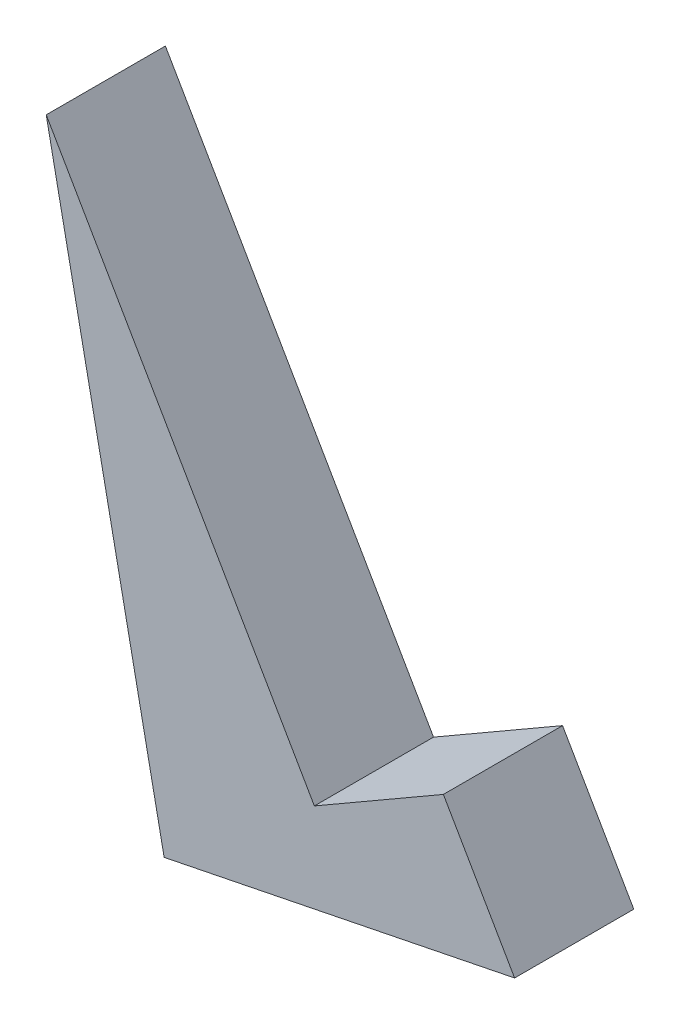
ISO-10303-21;
HEADER;
FILE_DESCRIPTION(('STEP AP214'),'2;1');
FILE_NAME('part.step','',(''),(''),'','','');
FILE_SCHEMA(('AUTOMOTIVE_DESIGN { 1 0 10303 214 1 1 1 1 }'));
ENDSEC;
DATA;
#1=APPLICATION_CONTEXT('core data for automotive mechanical design processes');
#2=APPLICATION_PROTOCOL_DEFINITION('international standard','automotive_design',2000,#1);
#3=PRODUCT_CONTEXT('',#1,'mechanical');
#4=PRODUCT('Part','Part','',(#3));
#5=PRODUCT_RELATED_PRODUCT_CATEGORY('part','',(#4));
#6=PRODUCT_DEFINITION_FORMATION('','',#4);
#7=PRODUCT_DEFINITION_CONTEXT('part definition',#1,'design');
#8=PRODUCT_DEFINITION('design','',#6,#7);
#9=PRODUCT_DEFINITION_SHAPE('','',#8);
#10=(LENGTH_UNIT() NAMED_UNIT(*) SI_UNIT(.MILLI.,.METRE.));
#11=(NAMED_UNIT(*) PLANE_ANGLE_UNIT() SI_UNIT($,.RADIAN.));
#12=(NAMED_UNIT(*) SI_UNIT($,.STERADIAN.) SOLID_ANGLE_UNIT());
#13=UNCERTAINTY_MEASURE_WITH_UNIT(LENGTH_MEASURE(1.E-05),#10,'distance_accuracy_value','');
#14=(GEOMETRIC_REPRESENTATION_CONTEXT(3) GLOBAL_UNCERTAINTY_ASSIGNED_CONTEXT((#13)) GLOBAL_UNIT_ASSIGNED_CONTEXT((#10,
#11,#12)) REPRESENTATION_CONTEXT('',''));
#15=CARTESIAN_POINT('',(0.,0.,0.));
#16=DIRECTION('',(0.,0.,1.));
#17=DIRECTION('',(1.,0.,0.));
#18=AXIS2_PLACEMENT_3D('',#15,#16,#17);
#19=CARTESIAN_POINT('',(428.678971124491,-124.199015795242,10.));
#20=DIRECTION('',(-0.866025633774708,-0.499999601644957,0.));
#21=DIRECTION('',(0.499999601644957,-0.866025633774708,0.));
#22=AXIS2_PLACEMENT_3D('',#19,#20,#21);
#23=PLANE('',#22);
#24=DIRECTION('',(-0.499999601644957,0.866025633774708,0.));
#25=VECTOR('',#24,1.);
#26=CARTESIAN_POINT('',(428.678971124491,-124.199015795242,0.));
#27=LINE('',#26,#25);
#28=CARTESIAN_POINT('',(428.678971124491,-124.199015795242,0.));
#29=VERTEX_POINT('',#28);
#30=CARTESIAN_POINT('',(422.702011511663,-113.846607073882,0.));
#31=VERTEX_POINT('',#30);
#32=EDGE_CURVE('E106',#29,#31,#27,.T.);
#33=ORIENTED_EDGE('',*,*,#32,.T.);
#34=DIRECTION('',(0.,0.,-1.));
#35=VECTOR('',#34,1.);
#36=CARTESIAN_POINT('',(422.702011511663,-113.846607073882,10.));
#37=LINE('',#36,#35);
#38=CARTESIAN_POINT('',(422.702011511663,-113.846607073882,10.));
#39=VERTEX_POINT('',#38);
#40=EDGE_CURVE('E11',#39,#31,#37,.T.);
#41=ORIENTED_EDGE('',*,*,#40,.F.);
#42=DIRECTION('',(-0.499999601644957,0.866025633774708,0.));
#43=VECTOR('',#42,1.);
#44=CARTESIAN_POINT('',(428.678971124491,-124.199015795242,10.));
#45=LINE('',#44,#43);
#46=CARTESIAN_POINT('',(428.678971124491,-124.199015795242,10.));
#47=VERTEX_POINT('',#46);
#48=EDGE_CURVE('E114',#47,#39,#45,.T.);
#49=ORIENTED_EDGE('',*,*,#48,.F.);
#50=DIRECTION('',(0.,0.,-1.));
#51=VECTOR('',#50,1.);
#52=CARTESIAN_POINT('',(428.678971124491,-124.199015795242,10.));
#53=LINE('',#52,#51);
#54=EDGE_CURVE('E102',#47,#29,#53,.T.);
#55=ORIENTED_EDGE('',*,*,#54,.T.);
#56=EDGE_LOOP('',(#33,#41,#49,#55));
#57=FACE_BOUND('',#56,.T.);
#58=ADVANCED_FACE('F32',(#57),#23,.F.);
#59=CARTESIAN_POINT('',(422.702011511663,-113.846607073882,10.));
#60=DIRECTION('',(0.499999601644959,-0.866025633774707,0.));
#61=DIRECTION('',(0.866025633774707,0.499999601644959,0.));
#62=AXIS2_PLACEMENT_3D('',#59,#60,#61);
#63=PLANE('',#62);
#64=DIRECTION('',(-0.866025633774707,-0.499999601644959,0.));
#65=VECTOR('',#64,1.);
#66=CARTESIAN_POINT('',(422.702011511663,-113.846607073882,0.));
#67=LINE('',#66,#65);
#68=CARTESIAN_POINT('',(411.876691089479,-120.096602094444,0.));
#69=VERTEX_POINT('',#68);
#70=EDGE_CURVE('E109',#31,#69,#67,.T.);
#71=ORIENTED_EDGE('',*,*,#70,.T.);
#72=DIRECTION('',(0.,0.,-1.));
#73=VECTOR('',#72,1.);
#74=CARTESIAN_POINT('',(411.876691089479,-120.096602094444,10.));
#75=LINE('',#74,#73);
#76=CARTESIAN_POINT('',(411.876691089479,-120.096602094444,10.));
#77=VERTEX_POINT('',#76);
#78=EDGE_CURVE('E40',#77,#69,#75,.T.);
#79=ORIENTED_EDGE('',*,*,#78,.F.);
#80=DIRECTION('',(-0.866025633774707,-0.499999601644959,0.));
#81=VECTOR('',#80,1.);
#82=CARTESIAN_POINT('',(422.702011511663,-113.846607073882,10.));
#83=LINE('',#82,#81);
#84=EDGE_CURVE('E82',#39,#77,#83,.T.);
#85=ORIENTED_EDGE('',*,*,#84,.F.);
#86=ORIENTED_EDGE('',*,*,#40,.T.);
#87=EDGE_LOOP('',(#71,#79,#85,#86));
#88=FACE_BOUND('',#87,.T.);
#89=ADVANCED_FACE('F133',(#88),#63,.F.);
#90=CARTESIAN_POINT('',(411.876691089479,-120.096602094444,10.));
#91=DIRECTION('',(-0.866025633774707,-0.499999601644959,0.));
#92=DIRECTION('',(0.499999601644959,-0.866025633774707,0.));
#93=AXIS2_PLACEMENT_3D('',#90,#91,#92);
#94=PLANE('',#93);
#95=DIRECTION('',(-0.499999601644959,0.866025633774706,0.));
#96=VECTOR('',#95,1.);
#97=CARTESIAN_POINT('',(411.876691089479,-120.096602094444,0.));
#98=LINE('',#97,#96);
#99=CARTESIAN_POINT('',(389.376709015456,-81.1254485745822,0.));
#100=VERTEX_POINT('',#99);
#101=EDGE_CURVE('E97',#69,#100,#98,.T.);
#102=ORIENTED_EDGE('',*,*,#101,.T.);
#103=DIRECTION('',(0.,0.,-1.));
#104=VECTOR('',#103,1.);
#105=CARTESIAN_POINT('',(389.376709015456,-81.1254485745822,10.));
#106=LINE('',#105,#104);
#107=CARTESIAN_POINT('',(389.376709015456,-81.1254485745822,10.));
#108=VERTEX_POINT('',#107);
#109=EDGE_CURVE('E94',#108,#100,#106,.T.);
#110=ORIENTED_EDGE('',*,*,#109,.F.);
#111=DIRECTION('',(-0.499999601644959,0.866025633774706,0.));
#112=VECTOR('',#111,1.);
#113=CARTESIAN_POINT('',(411.876691089479,-120.096602094444,10.));
#114=LINE('',#113,#112);
#115=EDGE_CURVE('E86',#77,#108,#114,.T.);
#116=ORIENTED_EDGE('',*,*,#115,.F.);
#117=ORIENTED_EDGE('',*,*,#78,.T.);
#118=EDGE_LOOP('',(#102,#110,#116,#117));
#119=FACE_BOUND('',#118,.T.);
#120=ADVANCED_FACE('F95',(#119),#94,.F.);
#121=CARTESIAN_POINT('',(389.376709015456,-81.1254485745822,10.));
#122=DIRECTION('',(0.980219477736482,0.19791355553882,0.));
#123=DIRECTION('',(-0.19791355553882,0.980219477736482,0.));
#124=AXIS2_PLACEMENT_3D('',#121,#122,#123);
#125=PLANE('',#124);
#126=DIRECTION('',(0.19791355553882,-0.980219477736483,0.));
#127=VECTOR('',#126,1.);
#128=CARTESIAN_POINT('',(389.376709015456,-81.1254485745822,0.));
#129=LINE('',#128,#127);
#130=CARTESIAN_POINT('',(399.272386792397,-130.136422461406,0.));
#131=VERTEX_POINT('',#130);
#132=EDGE_CURVE('E68',#100,#131,#129,.T.);
#133=ORIENTED_EDGE('',*,*,#132,.T.);
#134=DIRECTION('',(0.,0.,-1.));
#135=VECTOR('',#134,1.);
#136=CARTESIAN_POINT('',(399.272386792397,-130.136422461406,10.));
#137=LINE('',#136,#135);
#138=CARTESIAN_POINT('',(399.272386792397,-130.136422461406,10.));
#139=VERTEX_POINT('',#138);
#140=EDGE_CURVE('E98',#139,#131,#137,.T.);
#141=ORIENTED_EDGE('',*,*,#140,.F.);
#142=DIRECTION('',(0.19791355553882,-0.980219477736483,0.));
#143=VECTOR('',#142,1.);
#144=CARTESIAN_POINT('',(389.376709015456,-81.1254485745822,10.));
#145=LINE('',#144,#143);
#146=EDGE_CURVE('E90',#108,#139,#145,.T.);
#147=ORIENTED_EDGE('',*,*,#146,.F.);
#148=ORIENTED_EDGE('',*,*,#109,.T.);
#149=EDGE_LOOP('',(#133,#141,#147,#148));
#150=FACE_BOUND('',#149,.T.);
#151=ADVANCED_FACE('F100',(#150),#125,.F.);
#152=CARTESIAN_POINT('',(399.272386792397,-130.136422461406,10.));
#153=DIRECTION('',(-0.19791355553882,0.980219477736482,0.));
#154=DIRECTION('',(-0.980219477736483,-0.19791355553882,0.));
#155=AXIS2_PLACEMENT_3D('',#152,#153,#154);
#156=PLANE('',#155);
#157=DIRECTION('',(0.980219477736482,0.19791355553882,0.));
#158=VECTOR('',#157,1.);
#159=CARTESIAN_POINT('',(399.272386792397,-130.136422461406,0.));
#160=LINE('',#159,#158);
#161=EDGE_CURVE('E74',#131,#29,#160,.T.);
#162=ORIENTED_EDGE('',*,*,#161,.T.);
#163=ORIENTED_EDGE('',*,*,#54,.F.);
#164=DIRECTION('',(0.980219477736482,0.19791355553882,0.));
#165=VECTOR('',#164,1.);
#166=CARTESIAN_POINT('',(399.272386792397,-130.136422461406,10.));
#167=LINE('',#166,#165);
#168=EDGE_CURVE('E48',#139,#47,#167,.T.);
#169=ORIENTED_EDGE('',*,*,#168,.F.);
#170=ORIENTED_EDGE('',*,*,#140,.T.);
#171=EDGE_LOOP('',(#162,#163,#169,#170));
#172=FACE_BOUND('',#171,.T.);
#173=ADVANCED_FACE('F122',(#172),#156,.F.);
#174=CARTESIAN_POINT('',(0.,0.,10.));
#175=DIRECTION('',(0.,0.,1.));
#176=DIRECTION('',(1.,0.,0.));
#177=AXIS2_PLACEMENT_3D('',#174,#175,#176);
#178=PLANE('',#177);
#179=ORIENTED_EDGE('',*,*,#48,.T.);
#180=ORIENTED_EDGE('',*,*,#84,.T.);
#181=ORIENTED_EDGE('',*,*,#115,.T.);
#182=ORIENTED_EDGE('',*,*,#146,.T.);
#183=ORIENTED_EDGE('',*,*,#168,.T.);
#184=EDGE_LOOP('',(#179,#180,#181,#182,#183));
#185=FACE_BOUND('',#184,.T.);
#186=ADVANCED_FACE('F88',(#185),#178,.T.);
#187=CARTESIAN_POINT('',(0.,0.,0.));
#188=DIRECTION('',(0.,0.,1.));
#189=DIRECTION('',(1.,0.,0.));
#190=AXIS2_PLACEMENT_3D('',#187,#188,#189);
#191=PLANE('',#190);
#192=ORIENTED_EDGE('',*,*,#32,.F.);
#193=ORIENTED_EDGE('',*,*,#161,.F.);
#194=ORIENTED_EDGE('',*,*,#132,.F.);
#195=ORIENTED_EDGE('',*,*,#101,.F.);
#196=ORIENTED_EDGE('',*,*,#70,.F.);
#197=EDGE_LOOP('',(#192,#193,#194,#195,#196));
#198=FACE_BOUND('',#197,.T.);
#199=ADVANCED_FACE('F118',(#198),#191,.F.);
#200=CLOSED_SHELL('',(#58,#89,#120,#151,#173,#186,#199));
#201=MANIFOLD_SOLID_BREP('B2',#200);
#202=ADVANCED_BREP_SHAPE_REPRESENTATION('',(#18,#201),#14);
#203=SHAPE_DEFINITION_REPRESENTATION(#9,#202);
ENDSEC;
END-ISO-10303-21;
